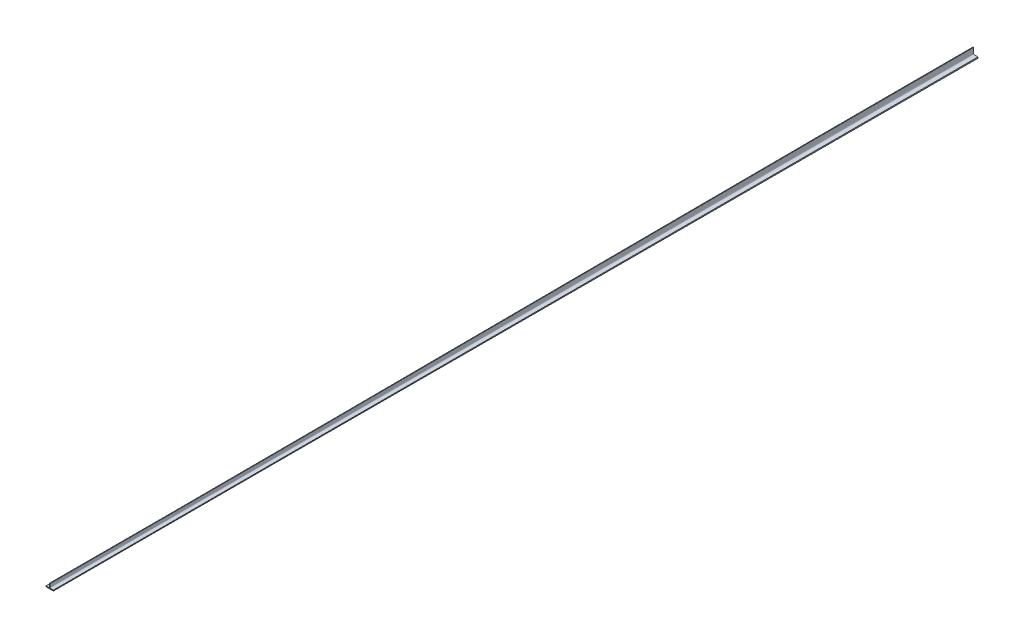
ISO-10303-21;
HEADER;
FILE_DESCRIPTION(('STEP AP214'),'2;1');
FILE_NAME('part.step','',(''),(''),'','','');
FILE_SCHEMA(('AUTOMOTIVE_DESIGN { 1 0 10303 214 1 1 1 1 }'));
ENDSEC;
DATA;
#1=APPLICATION_CONTEXT('core data for automotive mechanical design processes');
#2=APPLICATION_PROTOCOL_DEFINITION('international standard','automotive_design',2000,#1);
#3=PRODUCT_CONTEXT('',#1,'mechanical');
#4=PRODUCT('Part','Part','',(#3));
#5=PRODUCT_RELATED_PRODUCT_CATEGORY('part','',(#4));
#6=PRODUCT_DEFINITION_FORMATION('','',#4);
#7=PRODUCT_DEFINITION_CONTEXT('part definition',#1,'design');
#8=PRODUCT_DEFINITION('design','',#6,#7);
#9=PRODUCT_DEFINITION_SHAPE('','',#8);
#10=(LENGTH_UNIT() NAMED_UNIT(*) SI_UNIT(.MILLI.,.METRE.));
#11=(NAMED_UNIT(*) PLANE_ANGLE_UNIT() SI_UNIT($,.RADIAN.));
#12=(NAMED_UNIT(*) SI_UNIT($,.STERADIAN.) SOLID_ANGLE_UNIT());
#13=UNCERTAINTY_MEASURE_WITH_UNIT(LENGTH_MEASURE(1.E-05),#10,'distance_accuracy_value','');
#14=(GEOMETRIC_REPRESENTATION_CONTEXT(3) GLOBAL_UNCERTAINTY_ASSIGNED_CONTEXT((#13)) GLOBAL_UNIT_ASSIGNED_CONTEXT((#10,
#11,#12)) REPRESENTATION_CONTEXT('',''));
#15=CARTESIAN_POINT('',(0.,0.,0.));
#16=DIRECTION('',(0.,0.,1.));
#17=DIRECTION('',(1.,0.,0.));
#18=AXIS2_PLACEMENT_3D('',#15,#16,#17);
#19=CARTESIAN_POINT('',(4.00000000000001,7.,5000.));
#20=DIRECTION('',(0.,0.,-1.));
#21=DIRECTION('',(-1.,0.,0.));
#22=AXIS2_PLACEMENT_3D('',#19,#20,#21);
#23=PLANE('',#22);
#24=DIRECTION('',(0.,1.,0.));
#25=VECTOR('',#24,1.);
#26=CARTESIAN_POINT('',(20.,0.,5000.));
#27=LINE('',#26,#25);
#28=CARTESIAN_POINT('',(20.,0.,5000.));
#29=VERTEX_POINT('',#28);
#30=CARTESIAN_POINT('',(20.,4.49999999999999,5000.));
#31=VERTEX_POINT('',#30);
#32=EDGE_CURVE('E471',#29,#31,#27,.T.);
#33=ORIENTED_EDGE('',*,*,#32,.T.);
#34=DIRECTION('',(-1.,0.,0.));
#35=VECTOR('',#34,1.);
#36=CARTESIAN_POINT('',(20.,4.49999999999999,5000.));
#37=LINE('',#36,#35);
#38=CARTESIAN_POINT('',(4.00000000000019,4.49999999999999,5000.));
#39=VERTEX_POINT('',#38);
#40=EDGE_CURVE('E400',#31,#39,#37,.T.);
#41=ORIENTED_EDGE('',*,*,#40,.T.);
#42=CARTESIAN_POINT('',(4.00000000000001,7.,5000.));
#43=DIRECTION('',(0.,0.,-1.));
#44=DIRECTION('',(-1.,0.,0.));
#45=AXIS2_PLACEMENT_3D('',#42,#43,#44);
#46=CIRCLE('',#45,2.5);
#47=CARTESIAN_POINT('',(1.50000000000001,6.99999999999966,5000.));
#48=VERTEX_POINT('',#47);
#49=EDGE_CURVE('E411',#39,#48,#46,.T.);
#50=ORIENTED_EDGE('',*,*,#49,.T.);
#51=DIRECTION('',(0.,1.,0.));
#52=VECTOR('',#51,1.);
#53=CARTESIAN_POINT('',(1.5,7.00000000000002,5000.));
#54=LINE('',#53,#52);
#55=CARTESIAN_POINT('',(1.5,26.,5000.));
#56=VERTEX_POINT('',#55);
#57=EDGE_CURVE('E423',#48,#56,#54,.T.);
#58=ORIENTED_EDGE('',*,*,#57,.T.);
#59=DIRECTION('',(-1.,0.,0.));
#60=VECTOR('',#59,1.);
#61=CARTESIAN_POINT('',(1.5,26.,5000.));
#62=LINE('',#61,#60);
#63=CARTESIAN_POINT('',(-1.5,26.,5000.));
#64=VERTEX_POINT('',#63);
#65=EDGE_CURVE('E437',#56,#64,#62,.T.);
#66=ORIENTED_EDGE('',*,*,#65,.T.);
#67=DIRECTION('',(0.,-1.,0.));
#68=VECTOR('',#67,1.);
#69=CARTESIAN_POINT('',(-1.5,26.,5000.));
#70=LINE('',#69,#68);
#71=CARTESIAN_POINT('',(-1.5,7.00000000000001,5000.));
#72=VERTEX_POINT('',#71);
#73=EDGE_CURVE('E671',#64,#72,#70,.T.);
#74=ORIENTED_EDGE('',*,*,#73,.T.);
#75=CARTESIAN_POINT('',(-4.,6.99999999999999,5000.));
#76=DIRECTION('',(0.,0.,-1.));
#77=DIRECTION('',(-1.,0.,0.));
#78=AXIS2_PLACEMENT_3D('',#75,#76,#77);
#79=CIRCLE('',#78,2.5);
#80=CARTESIAN_POINT('',(-4.00000000006954,4.49999999999999,5000.));
#81=VERTEX_POINT('',#80);
#82=EDGE_CURVE('E523',#72,#81,#79,.T.);
#83=ORIENTED_EDGE('',*,*,#82,.T.);
#84=DIRECTION('',(-1.,0.,0.));
#85=VECTOR('',#84,1.);
#86=CARTESIAN_POINT('',(-4.00000000000002,4.49999999999999,5000.));
#87=LINE('',#86,#85);
#88=CARTESIAN_POINT('',(-20.,4.49999999999999,5000.));
#89=VERTEX_POINT('',#88);
#90=EDGE_CURVE('E686',#81,#89,#87,.T.);
#91=ORIENTED_EDGE('',*,*,#90,.T.);
#92=DIRECTION('',(0.,-1.,0.));
#93=VECTOR('',#92,1.);
#94=CARTESIAN_POINT('',(-20.,4.49999999999999,5000.));
#95=LINE('',#94,#93);
#96=CARTESIAN_POINT('',(-20.,0.,5000.));
#97=VERTEX_POINT('',#96);
#98=EDGE_CURVE('E231',#89,#97,#95,.T.);
#99=ORIENTED_EDGE('',*,*,#98,.T.);
#100=DIRECTION('',(1.,0.,0.));
#101=VECTOR('',#100,1.);
#102=CARTESIAN_POINT('',(-20.,0.,5000.));
#103=LINE('',#102,#101);
#104=EDGE_CURVE('E12',#97,#29,#103,.T.);
#105=ORIENTED_EDGE('',*,*,#104,.T.);
#106=EDGE_LOOP('',(#33,#41,#50,#58,#66,#74,#83,#91,#99,#105));
#107=FACE_BOUND('',#106,.T.);
#108=ADVANCED_FACE('F221',(#107),#23,.F.);
#109=CARTESIAN_POINT('',(-5.75,10.5,0.));
#110=DIRECTION('',(0.,0.,1.));
#111=DIRECTION('',(1.,0.,0.));
#112=AXIS2_PLACEMENT_3D('',#109,#110,#111);
#113=PLANE('',#112);
#114=DIRECTION('',(0.,-1.,0.));
#115=VECTOR('',#114,1.);
#116=CARTESIAN_POINT('',(-25.,0.,0.));
#117=LINE('',#116,#115);
#118=CARTESIAN_POINT('',(-25.,6.5,0.));
#119=VERTEX_POINT('',#118);
#120=CARTESIAN_POINT('',(-25.,0.,0.));
#121=VERTEX_POINT('',#120);
#122=EDGE_CURVE('E307',#119,#121,#117,.T.);
#123=ORIENTED_EDGE('',*,*,#122,.F.);
#124=DIRECTION('',(-1.,0.,0.));
#125=VECTOR('',#124,1.);
#126=CARTESIAN_POINT('',(-25.,6.5,0.));
#127=LINE('',#126,#125);
#128=CARTESIAN_POINT('',(-5.74999999999348,6.5,0.));
#129=VERTEX_POINT('',#128);
#130=EDGE_CURVE('E324',#129,#119,#127,.T.);
#131=ORIENTED_EDGE('',*,*,#130,.F.);
#132=CARTESIAN_POINT('',(-5.75,10.5,0.));
#133=DIRECTION('',(0.,0.,-1.));
#134=DIRECTION('',(1.,0.,0.));
#135=AXIS2_PLACEMENT_3D('',#132,#133,#134);
#136=CIRCLE('',#135,4.);
#137=CARTESIAN_POINT('',(-1.75,10.5,0.));
#138=VERTEX_POINT('',#137);
#139=EDGE_CURVE('E569',#138,#129,#136,.T.);
#140=ORIENTED_EDGE('',*,*,#139,.F.);
#141=DIRECTION('',(0.,-1.,0.));
#142=VECTOR('',#141,1.);
#143=CARTESIAN_POINT('',(-1.75,10.5,0.));
#144=LINE('',#143,#142);
#145=CARTESIAN_POINT('',(-1.75,40.,0.));
#146=VERTEX_POINT('',#145);
#147=EDGE_CURVE('E485',#146,#138,#144,.T.);
#148=ORIENTED_EDGE('',*,*,#147,.F.);
#149=DIRECTION('',(-1.,0.,0.));
#150=VECTOR('',#149,1.);
#151=CARTESIAN_POINT('',(-1.75,40.,0.));
#152=LINE('',#151,#150);
#153=CARTESIAN_POINT('',(1.75,40.,0.));
#154=VERTEX_POINT('',#153);
#155=EDGE_CURVE('E591',#154,#146,#152,.T.);
#156=ORIENTED_EDGE('',*,*,#155,.F.);
#157=DIRECTION('',(0.,1.,0.));
#158=VECTOR('',#157,1.);
#159=CARTESIAN_POINT('',(1.75,10.5,0.));
#160=LINE('',#159,#158);
#161=CARTESIAN_POINT('',(1.75,10.5000000000239,0.));
#162=VERTEX_POINT('',#161);
#163=EDGE_CURVE('E604',#162,#154,#160,.T.);
#164=ORIENTED_EDGE('',*,*,#163,.F.);
#165=CARTESIAN_POINT('',(5.75,10.5,0.));
#166=DIRECTION('',(0.,0.,-1.));
#167=DIRECTION('',(-1.,0.,0.));
#168=AXIS2_PLACEMENT_3D('',#165,#166,#167);
#169=CIRCLE('',#168,4.);
#170=CARTESIAN_POINT('',(5.74999999993137,6.5,0.));
#171=VERTEX_POINT('',#170);
#172=EDGE_CURVE('E611',#171,#162,#169,.T.);
#173=ORIENTED_EDGE('',*,*,#172,.F.);
#174=DIRECTION('',(-1.,0.,0.));
#175=VECTOR('',#174,1.);
#176=CARTESIAN_POINT('',(25.,6.5,0.));
#177=LINE('',#176,#175);
#178=CARTESIAN_POINT('',(25.,6.5,0.));
#179=VERTEX_POINT('',#178);
#180=EDGE_CURVE('E742',#179,#171,#177,.T.);
#181=ORIENTED_EDGE('',*,*,#180,.F.);
#182=DIRECTION('',(0.,1.,0.));
#183=VECTOR('',#182,1.);
#184=CARTESIAN_POINT('',(25.,0.,0.));
#185=LINE('',#184,#183);
#186=CARTESIAN_POINT('',(25.,0.,0.));
#187=VERTEX_POINT('',#186);
#188=EDGE_CURVE('E310',#187,#179,#185,.T.);
#189=ORIENTED_EDGE('',*,*,#188,.F.);
#190=DIRECTION('',(1.,0.,0.));
#191=VECTOR('',#190,1.);
#192=CARTESIAN_POINT('',(-25.,0.,0.));
#193=LINE('',#192,#191);
#194=EDGE_CURVE('E303',#121,#187,#193,.T.);
#195=ORIENTED_EDGE('',*,*,#194,.F.);
#196=EDGE_LOOP('',(#123,#131,#140,#148,#156,#164,#173,#181,#189,#195));
#197=FACE_BOUND('',#196,.T.);
#198=ADVANCED_FACE('F305',(#197),#113,.F.);
#199=CARTESIAN_POINT('',(-1.75,10.5,0.));
#200=CARTESIAN_POINT('',(-1.76041665865072,10.6458332211101,166.666794921776));
#201=CARTESIAN_POINT('',(-1.72796755953533,10.1915458334947,1500.00232594243));
#202=CARTESIAN_POINT('',(-1.50305376714055,7.04275273996762,3166.6637854278));
#203=CARTESIAN_POINT('',(-1.4814814927412,6.74074089837668,4666.66646399189));
#204=CARTESIAN_POINT('',(-1.5,7.00000000000001,5000.));
#205=CARTESIAN_POINT('',(-1.75,10.0300900609855,0.));
#206=CARTESIAN_POINT('',(-1.76057678876177,10.1698963593273,166.666784586186));
#207=CARTESIAN_POINT('',(-1.72738315193246,9.73703498879041,1500.00236346311));
#208=CARTESIAN_POINT('',(-1.50361901353656,6.66865880947282,3166.66375249179));
#209=CARTESIAN_POINT('',(-1.48119681712089,6.38472128154824,4666.66648032468));
#210=CARTESIAN_POINT('',(-1.5,6.63326584885906,5000.));
#211=CARTESIAN_POINT('',(-1.91725946446787,9.01920723896802,0.));
#212=CARTESIAN_POINT('',(-1.92815651345172,9.14695969177323,166.666763915007));
#213=CARTESIAN_POINT('',(-1.89425709920794,8.74777196889063,1500.00243850448));
#214=CARTESIAN_POINT('',(-1.65810540869848,6.01232462692904,3166.66368661978));
#215=CARTESIAN_POINT('',(-1.63563563736816,5.74517506881954,4666.66651299026));
#216=CARTESIAN_POINT('',(-1.65500817148788,5.97229056750532,5000.));
#217=CARTESIAN_POINT('',(-2.83482059203226,7.58482059203225,0.));
#218=CARTESIAN_POINT('',(-2.86149230183344,7.68434394742151,166.66672801735));
#219=CARTESIAN_POINT('',(-2.77861383438785,7.37462384711103,1500.00256882163));
#220=CARTESIAN_POINT('',(-2.19884393375781,5.21999096220804,3166.66357222618));
#221=CARTESIAN_POINT('',(-2.14404507482599,5.01453102899276,4666.66656971743));
#222=CARTESIAN_POINT('',(-2.19146145186028,5.19146145186028,5000.));
#223=CARTESIAN_POINT('',(-4.26920723896802,6.66725946446786,0.));
#224=CARTESIAN_POINT('',(-4.32381513687989,6.75110520060494,166.666725389624));
#225=CARTESIAN_POINT('',(-4.15283095310561,6.48991295106523,1500.00257836091));
#226=CARTESIAN_POINT('',(-2.99014363299043,4.6795949849866,3166.66356385254));
#227=CARTESIAN_POINT('',(-2.8752098531299,4.50594907389413,4666.66657386989));
#228=CARTESIAN_POINT('',(-2.97229056750534,4.65500817148786,5000.));
#229=CARTESIAN_POINT('',(-5.28009006098553,6.5,0.));
#230=CARTESIAN_POINT('',(-5.34746829753325,6.58346199158506,166.666735534587));
#231=CARTESIAN_POINT('',(-5.1394790749114,6.32327069477005,1500.00254153225));
#232=CARTESIAN_POINT('',(-3.64900696822546,4.52488449776451,3166.66359618106));
#233=CARTESIAN_POINT('',(-3.51348230683894,4.35162311317983,4666.66655783834));
#234=CARTESIAN_POINT('',(-3.63326584885907,4.49999999999999,5000.));
#235=CARTESIAN_POINT('',(-7.40785550019297,6.5,0.));
#236=CARTESIAN_POINT('',(-7.50031175854618,6.58287925684215,166.666756815213));
#237=CARTESIAN_POINT('',(-7.20559005126586,6.32539743133699,1500.00246427844));
#238=CARTESIAN_POINT('',(-5.33510641951328,4.52282749677106,3166.66366399518));
#239=CARTESIAN_POINT('',(-5.12948171528132,4.35265908228241,4666.66652420968));
#240=CARTESIAN_POINT('',(-5.29384841455515,4.49999999999999,5000.));
#241=CARTESIAN_POINT('',(-10.6391788230394,6.5,0.));
#242=CARTESIAN_POINT('',(-10.7496348322902,6.58354390944906,166.666780698332));
#243=CARTESIAN_POINT('',(-10.4087571915927,6.32297172816222,1500.00237757696));
#244=CARTESIAN_POINT('',(-7.96371400387778,4.52517367603479,3166.66374010251));
#245=CARTESIAN_POINT('',(-7.74172813198465,4.35147747296844,4666.66648646847));
#246=CARTESIAN_POINT('',(-7.93809439810482,4.50000000000001,5000.00000000001));
#247=CARTESIAN_POINT('',(-15.375,6.5,0.));
#248=CARTESIAN_POINT('',(-15.516377705298,6.58327708444848,166.66682676621));
#249=CARTESIAN_POINT('',(-15.0748145998053,6.32394552645723,1500.00221033945));
#250=CARTESIAN_POINT('',(-12.0438832453049,4.52423181966586,3166.66388690518));
#251=CARTESIAN_POINT('',(-11.7486618072331,4.35195182002062,4666.66641366979));
#252=CARTESIAN_POINT('',(-12.,4.49999999999998,4999.99999999999));
#253=CARTESIAN_POINT('',(-20.1108211769606,6.5,0.));
#254=CARTESIAN_POINT('',(-20.2786035349036,6.58334727180046,166.666874149964));
#255=CARTESIAN_POINT('',(-19.7573573180287,6.32368937124869,1500.002038325));
#256=CARTESIAN_POINT('',(-16.1081076855479,4.52447959086938,3166.66403790105));
#257=CARTESIAN_POINT('',(-15.7636257791287,4.3518270336426,4666.66633879176));
#258=CARTESIAN_POINT('',(-16.0619056018952,4.50000000000001,5000.00000000001));
#259=CARTESIAN_POINT('',(-23.3421444998071,6.5,0.));
#260=CARTESIAN_POINT('',(-23.536960589608,6.58333787879478,166.66693721629));
#261=CARTESIAN_POINT('',(-22.9275542207547,6.32372365062078,1500.00180937903));
#262=CARTESIAN_POINT('',(-18.7686045672862,4.52444645474237,3166.66423887202));
#263=CARTESIAN_POINT('',(-18.3598117512132,4.35184372055708,4666.66623913131));
#264=CARTESIAN_POINT('',(-18.7061515854449,4.49999999999999,5000.));
#265=CARTESIAN_POINT('',(-25.,6.5,0.));
#266=CARTESIAN_POINT('',(-25.2083329557299,6.58333318229194,166.666968749452));
#267=CARTESIAN_POINT('',(-24.559351975767,6.32374079030681,1500.00169490604));
#268=CARTESIAN_POINT('',(-20.0610747166972,4.52442988667886,3166.6643393575));
#269=CARTESIAN_POINT('',(-19.6296301600358,4.35185206401432,4666.6661893011));
#270=CARTESIAN_POINT('',(-20.,4.49999999999999,5000.));
#271=B_SPLINE_SURFACE_WITH_KNOTS('',3,3,((#199,#200,#201,#202,#203,#204),(#205,#206,#207,#208,
#209,#210),(#211,#212,#213,#214,#215,#216),(#217,#218,#219,#220,#221,#222),(#223,#224,#225,#226,
#227,#228),(#229,#230,#231,#232,#233,#234),(#235,#236,#237,#238,#239,#240),(#241,#242,#243,#244,
#245,#246),(#247,#248,#249,#250,#251,#252),(#253,#254,#255,#256,#257,#258),(#259,#260,#261,#262,
#263,#264),(#265,#266,#267,#268,#269,#270)),.UNSPECIFIED.,.F.,.F.,.F.,(4,1,1,1,2,1,1,1,4),(4,1,
1,4),(0.,0.0552116709786178,0.110423341957236,0.165635012935853,0.220846683914471,
0.415635012935853,0.610423341957235,0.805211670978618,1.),(0.,0.0999998594638137,
0.800000281072373,1.),.UNSPECIFIED.);
#272=CARTESIAN_POINT('',(-25.,6.5,0.));
#273=CARTESIAN_POINT('',(-25.2083329557299,6.58333318229194,166.666968749452));
#274=CARTESIAN_POINT('',(-24.559351975767,6.32374079030681,1500.00169490604));
#275=CARTESIAN_POINT('',(-20.0610747166972,4.52442988667886,3166.6643393575));
#276=CARTESIAN_POINT('',(-19.6296301600358,4.35185206401432,4666.6661893011));
#277=CARTESIAN_POINT('',(-20.,4.49999999999999,5000.));
#278=B_SPLINE_CURVE_WITH_KNOTS('',3,(#272,#273,#274,#275,#276,#277),.UNSPECIFIED.,.F.,.F.,(4,1,
1,4),(0.,0.0999998594638137,0.800000281072373,1.),.UNSPECIFIED.);
#279=EDGE_CURVE('E323',#119,#89,#278,.T.);
#280=CARTESIAN_POINT('',(-1.75,10.5,0.));
#281=CARTESIAN_POINT('',(-1.76041665865072,10.6458332211101,166.666794921776));
#282=CARTESIAN_POINT('',(-1.72796755953533,10.1915458334947,1500.00232594243));
#283=CARTESIAN_POINT('',(-1.50305376714055,7.04275273996762,3166.6637854278));
#284=CARTESIAN_POINT('',(-1.4814814927412,6.74074089837668,4666.66646399189));
#285=CARTESIAN_POINT('',(-1.5,7.00000000000001,5000.));
#286=B_SPLINE_CURVE_WITH_KNOTS('',3,(#280,#281,#282,#283,#284,#285),.UNSPECIFIED.,.F.,.F.,(4,1,
1,4),(0.,0.0999998594638137,0.800000281072373,1.),.UNSPECIFIED.);
#287=EDGE_CURVE('E315',#72,#138,#286,.F.);
#288=ORIENTED_EDGE('',*,*,#139,.T.);
#289=ORIENTED_EDGE('',*,*,#130,.T.);
#290=ORIENTED_EDGE('',*,*,#279,.T.);
#291=ORIENTED_EDGE('',*,*,#90,.F.);
#292=ORIENTED_EDGE('',*,*,#82,.F.);
#293=ORIENTED_EDGE('',*,*,#287,.T.);
#294=EDGE_LOOP('',(#288,#289,#290,#291,#292,#293));
#295=FACE_BOUND('',#294,.T.);
#296=ADVANCED_FACE('F528',(#295),#271,.T.);
#297=CARTESIAN_POINT('',(-25.,6.5,0.));
#298=CARTESIAN_POINT('',(-25.2083329557299,6.58333318229194,166.666968749452));
#299=CARTESIAN_POINT('',(-24.559351975767,6.32374079030681,1500.00169490604));
#300=CARTESIAN_POINT('',(-20.0610747166972,4.52442988667886,3166.6643393575));
#301=CARTESIAN_POINT('',(-19.6296301600358,4.35185206401432,4666.6661893011));
#302=CARTESIAN_POINT('',(-20.,4.49999999999999,5000.));
#303=CARTESIAN_POINT('',(-25.,4.33333333333333,0.));
#304=CARTESIAN_POINT('',(-25.2083329730909,4.38888878819463,166.66695486061));
#305=CARTESIAN_POINT('',(-24.5593519130407,4.21582719353787,1500.00174532589));
#306=CARTESIAN_POINT('',(-20.0610747667237,3.01628659111924,3166.66429509848));
#307=CARTESIAN_POINT('',(-19.6296301356494,2.90123470934288,4666.66621124891));
#308=CARTESIAN_POINT('',(-20.,3.,5000.));
#309=CARTESIAN_POINT('',(-25.,2.16666666666667,0.));
#310=CARTESIAN_POINT('',(-25.208332990452,2.19444439409731,166.666940971768));
#311=CARTESIAN_POINT('',(-24.5593518503143,2.10791359676894,1500.00179574573));
#312=CARTESIAN_POINT('',(-20.0610748167502,1.50814329555962,3166.66425083946));
#313=CARTESIAN_POINT('',(-19.6296301112629,1.45061735467144,4666.66623319673));
#314=CARTESIAN_POINT('',(-20.,1.5,5000.));
#315=CARTESIAN_POINT('',(-25.,0.,0.));
#316=CARTESIAN_POINT('',(-25.208333007813,0.,166.666927082926));
#317=CARTESIAN_POINT('',(-24.5593517875879,0.,1500.00184616558));
#318=CARTESIAN_POINT('',(-20.0610748667768,0.,3166.66420658043));
#319=CARTESIAN_POINT('',(-19.6296300868764,0.,4666.66625514454));
#320=CARTESIAN_POINT('',(-20.,0.,5000.));
#321=B_SPLINE_SURFACE_WITH_KNOTS('',3,3,((#297,#298,#299,#300,#301,#302),(#303,#304,#305,#306,
#307,#308),(#309,#310,#311,#312,#313,#314),(#315,#316,#317,#318,#319,#320)),.UNSPECIFIED.,.F.,
.F.,.F.,(4,4),(4,1,1,4),(0.,1.),(0.,0.0999998594638137,0.800000281072373,1.),.UNSPECIFIED.);
#322=CARTESIAN_POINT('',(-25.,0.,0.));
#323=CARTESIAN_POINT('',(-25.208333007813,0.,166.666927082926));
#324=CARTESIAN_POINT('',(-24.5593517875879,0.,1500.00184616558));
#325=CARTESIAN_POINT('',(-20.0610748667768,0.,3166.66420658043));
#326=CARTESIAN_POINT('',(-19.6296300868764,0.,4666.66625514454));
#327=CARTESIAN_POINT('',(-20.,0.,5000.));
#328=B_SPLINE_CURVE_WITH_KNOTS('',3,(#322,#323,#324,#325,#326,#327),.UNSPECIFIED.,.F.,.F.,(4,1,
1,4),(0.,0.0999998594638137,0.800000281072373,1.),.UNSPECIFIED.);
#329=EDGE_CURVE('E246',#121,#97,#328,.T.);
#330=ORIENTED_EDGE('',*,*,#122,.T.);
#331=ORIENTED_EDGE('',*,*,#329,.T.);
#332=ORIENTED_EDGE('',*,*,#98,.F.);
#333=ORIENTED_EDGE('',*,*,#279,.F.);
#334=EDGE_LOOP('',(#330,#331,#332,#333));
#335=FACE_BOUND('',#334,.T.);
#336=ADVANCED_FACE('F321',(#335),#321,.T.);
#337=CARTESIAN_POINT('',(-1.75,40.,0.));
#338=CARTESIAN_POINT('',(-1.76041653902338,40.5833261853089,166.668708959349));
#339=CARTESIAN_POINT('',(-1.72796799175511,38.7662075382858,1499.99537752378));
#340=CARTESIAN_POINT('',(-1.50305342242919,26.1709916560344,3166.66988482633));
#341=CARTESIAN_POINT('',(-1.48148166077788,24.9629730035608,4666.66343933166));
#342=CARTESIAN_POINT('',(-1.5,26.,5000.));
#343=CARTESIAN_POINT('',(-1.75,30.1666666666667,0.));
#344=CARTESIAN_POINT('',(-1.76041657889916,30.6041618639093,166.668070946825));
#345=CARTESIAN_POINT('',(-1.72796784768185,29.2413203033555,1499.99769366333));
#346=CARTESIAN_POINT('',(-1.50305353733298,19.7949120173455,3166.66785169348));
#347=CARTESIAN_POINT('',(-1.48148160476565,18.8888956351661,4666.66444755174));
#348=CARTESIAN_POINT('',(-1.5,19.6666666666667,5000.));
#349=CARTESIAN_POINT('',(-1.75,20.3333333333334,0.));
#350=CARTESIAN_POINT('',(-1.76041661877494,20.6249975425098,166.6674329343));
#351=CARTESIAN_POINT('',(-1.72796770360859,19.7164330684251,1500.00000980288));
#352=CARTESIAN_POINT('',(-1.50305365223676,13.4188323786566,3166.66581856064));
#353=CARTESIAN_POINT('',(-1.48148154875342,12.8148182667714,4666.66545577181));
#354=CARTESIAN_POINT('',(-1.5,13.3333333333333,5000.));
#355=CARTESIAN_POINT('',(-1.75,10.5,0.));
#356=CARTESIAN_POINT('',(-1.76041665865072,10.6458332211101,166.666794921776));
#357=CARTESIAN_POINT('',(-1.72796755953533,10.1915458334947,1500.00232594243));
#358=CARTESIAN_POINT('',(-1.50305376714055,7.04275273996762,3166.6637854278));
#359=CARTESIAN_POINT('',(-1.4814814927412,6.74074089837668,4666.66646399189));
#360=CARTESIAN_POINT('',(-1.5,7.00000000000001,5000.));
#361=B_SPLINE_SURFACE_WITH_KNOTS('',3,3,((#337,#338,#339,#340,#341,#342),(#343,#344,#345,#346,
#347,#348),(#349,#350,#351,#352,#353,#354),(#355,#356,#357,#358,#359,#360)),.UNSPECIFIED.,.F.,
.F.,.F.,(4,4),(4,1,1,4),(0.,1.),(0.,0.0999998594638137,0.800000281072373,1.),.UNSPECIFIED.);
#362=CARTESIAN_POINT('',(-1.75,40.,0.));
#363=CARTESIAN_POINT('',(-1.76041653902338,40.5833261853089,166.668708959349));
#364=CARTESIAN_POINT('',(-1.72796799175511,38.7662075382858,1499.99537752378));
#365=CARTESIAN_POINT('',(-1.50305342242919,26.1709916560344,3166.66988482633));
#366=CARTESIAN_POINT('',(-1.48148166077788,24.9629730035608,4666.66343933166));
#367=CARTESIAN_POINT('',(-1.5,26.,5000.));
#368=B_SPLINE_CURVE_WITH_KNOTS('',3,(#362,#363,#364,#365,#366,#367),.UNSPECIFIED.,.F.,.F.,(4,1,
1,4),(0.,0.0999998594638137,0.800000281072373,1.),.UNSPECIFIED.);
#369=EDGE_CURVE('E464',#146,#64,#368,.T.);
#370=ORIENTED_EDGE('',*,*,#147,.T.);
#371=ORIENTED_EDGE('',*,*,#287,.F.);
#372=ORIENTED_EDGE('',*,*,#73,.F.);
#373=ORIENTED_EDGE('',*,*,#369,.F.);
#374=EDGE_LOOP('',(#370,#371,#372,#373));
#375=FACE_BOUND('',#374,.T.);
#376=ADVANCED_FACE('F491',(#375),#361,.T.);
#377=CARTESIAN_POINT('',(-25.,0.,0.));
#378=DIRECTION('',(0.,-1.,0.));
#379=DIRECTION('',(1.,0.,0.));
#380=AXIS2_PLACEMENT_3D('',#377,#378,#379);
#381=PLANE('',#380);
#382=ORIENTED_EDGE('',*,*,#194,.T.);
#383=CARTESIAN_POINT('',(25.,0.,0.));
#384=CARTESIAN_POINT('',(25.208333007813,0.,166.666927082926));
#385=CARTESIAN_POINT('',(24.5593517875879,0.,1500.00184616558));
#386=CARTESIAN_POINT('',(20.0610748667768,0.,3166.66420658043));
#387=CARTESIAN_POINT('',(19.6296300868764,0.,4666.66625514454));
#388=CARTESIAN_POINT('',(20.,0.,5000.));
#389=B_SPLINE_CURVE_WITH_KNOTS('',3,(#383,#384,#385,#386,#387,#388),.UNSPECIFIED.,.F.,.F.,(4,1,
1,4),(0.,0.0999998594638137,0.800000281072373,1.),.UNSPECIFIED.);
#390=EDGE_CURVE('E330',#187,#29,#389,.T.);
#391=ORIENTED_EDGE('',*,*,#390,.T.);
#392=ORIENTED_EDGE('',*,*,#104,.F.);
#393=ORIENTED_EDGE('',*,*,#329,.F.);
#394=EDGE_LOOP('',(#382,#391,#392,#393));
#395=FACE_BOUND('',#394,.T.);
#396=ADVANCED_FACE('F328',(#395),#381,.T.);
#397=CARTESIAN_POINT('',(25.,0.,0.));
#398=CARTESIAN_POINT('',(25.208333007813,0.,166.666927082926));
#399=CARTESIAN_POINT('',(24.5593517875879,0.,1500.00184616558));
#400=CARTESIAN_POINT('',(20.0610748667768,0.,3166.66420658043));
#401=CARTESIAN_POINT('',(19.6296300868764,0.,4666.66625514454));
#402=CARTESIAN_POINT('',(20.,0.,5000.));
#403=CARTESIAN_POINT('',(25.,2.16666666666667,0.));
#404=CARTESIAN_POINT('',(25.208332990452,2.19444439409731,166.666940971768));
#405=CARTESIAN_POINT('',(24.5593518503143,2.10791359676894,1500.00179574573));
#406=CARTESIAN_POINT('',(20.0610748167502,1.50814329555962,3166.66425083946));
#407=CARTESIAN_POINT('',(19.6296301112629,1.45061735467144,4666.66623319673));
#408=CARTESIAN_POINT('',(20.,1.5,5000.));
#409=CARTESIAN_POINT('',(25.,4.33333333333333,0.));
#410=CARTESIAN_POINT('',(25.2083329730909,4.38888878819463,166.66695486061));
#411=CARTESIAN_POINT('',(24.5593519130407,4.21582719353787,1500.00174532589));
#412=CARTESIAN_POINT('',(20.0610747667237,3.01628659111924,3166.66429509848));
#413=CARTESIAN_POINT('',(19.6296301356494,2.90123470934288,4666.66621124891));
#414=CARTESIAN_POINT('',(20.,3.,5000.));
#415=CARTESIAN_POINT('',(25.,6.5,0.));
#416=CARTESIAN_POINT('',(25.2083329557299,6.58333318229194,166.666968749452));
#417=CARTESIAN_POINT('',(24.559351975767,6.32374079030681,1500.00169490604));
#418=CARTESIAN_POINT('',(20.0610747166972,4.52442988667886,3166.6643393575));
#419=CARTESIAN_POINT('',(19.6296301600358,4.35185206401432,4666.6661893011));
#420=CARTESIAN_POINT('',(20.,4.49999999999999,5000.));
#421=B_SPLINE_SURFACE_WITH_KNOTS('',3,3,((#397,#398,#399,#400,#401,#402),(#403,#404,#405,#406,
#407,#408),(#409,#410,#411,#412,#413,#414),(#415,#416,#417,#418,#419,#420)),.UNSPECIFIED.,.F.,
.F.,.F.,(4,4),(4,1,1,4),(0.,1.),(0.,0.0999998594638137,0.800000281072373,1.),.UNSPECIFIED.);
#422=CARTESIAN_POINT('',(25.,6.5,0.));
#423=CARTESIAN_POINT('',(25.2083329557299,6.58333318229194,166.666968749452));
#424=CARTESIAN_POINT('',(24.559351975767,6.32374079030681,1500.00169490604));
#425=CARTESIAN_POINT('',(20.0610747166972,4.52442988667886,3166.6643393575));
#426=CARTESIAN_POINT('',(19.6296301600358,4.35185206401432,4666.6661893011));
#427=CARTESIAN_POINT('',(20.,4.49999999999999,5000.));
#428=B_SPLINE_CURVE_WITH_KNOTS('',3,(#422,#423,#424,#425,#426,#427),.UNSPECIFIED.,.F.,.F.,(4,1,
1,4),(0.,0.0999998594638137,0.800000281072373,1.),.UNSPECIFIED.);
#429=EDGE_CURVE('E332',#179,#31,#428,.T.);
#430=ORIENTED_EDGE('',*,*,#188,.T.);
#431=ORIENTED_EDGE('',*,*,#429,.T.);
#432=ORIENTED_EDGE('',*,*,#32,.F.);
#433=ORIENTED_EDGE('',*,*,#390,.F.);
#434=EDGE_LOOP('',(#430,#431,#432,#433));
#435=FACE_BOUND('',#434,.T.);
#436=ADVANCED_FACE('F363',(#435),#421,.T.);
#437=CARTESIAN_POINT('',(25.,6.5,0.));
#438=CARTESIAN_POINT('',(25.2083329557299,6.58333318229194,166.666968749452));
#439=CARTESIAN_POINT('',(24.559351975767,6.32374079030681,1500.00169490604));
#440=CARTESIAN_POINT('',(20.0610747166972,4.52442988667886,3166.6643393575));
#441=CARTESIAN_POINT('',(19.6296301600358,4.35185206401432,4666.6661893011));
#442=CARTESIAN_POINT('',(20.,4.49999999999999,5000.));
#443=CARTESIAN_POINT('',(23.2708675053462,6.5,0.));
#444=CARTESIAN_POINT('',(23.4620894768583,6.58333662098395,166.6669297409));
#445=CARTESIAN_POINT('',(22.8614855665221,6.32372824123831,1500.0018365165));
#446=CARTESIAN_POINT('',(18.8250199368705,4.52444201234531,3166.6642150505));
#447=CARTESIAN_POINT('',(18.4186212563438,4.3518459580603,4666.66625094428));
#448=CARTESIAN_POINT('',(18.7585715422998,4.49999999999999,5000.));
#449=CARTESIAN_POINT('',(19.9840068946728,6.5,0.));
#450=CARTESIAN_POINT('',(20.1410068977494,6.58334349836799,166.666851723794));
#451=CARTESIAN_POINT('',(19.6543769592137,6.3237031431013,1500.0021197374));
#452=CARTESIAN_POINT('',(16.2186622365732,4.52446626367819,3166.66396643649));
#453=CARTESIAN_POINT('',(15.898678389759,4.35183374615226,4666.66637423065));
#454=CARTESIAN_POINT('',(16.1777895676989,4.49999999999998,5000.));
#455=CARTESIAN_POINT('',(15.2747161456717,6.5,0.));
#456=CARTESIAN_POINT('',(15.407828543513,6.58329222932354,166.666814180508));
#457=CARTESIAN_POINT('',(14.9920051189238,6.3238902542567,1500.00225602859));
#458=CARTESIAN_POINT('',(12.139680700083,4.52428527580739,3166.66384679882));
#459=CARTESIAN_POINT('',(11.8615599633816,4.35192489814013,4666.66643355833));
#460=CARTESIAN_POINT('',(12.098204270261,4.50000000000001,5000.));
#461=CARTESIAN_POINT('',(10.6058879123595,6.5,0.));
#462=CARTESIAN_POINT('',(10.7144534651925,6.58348714092362,166.666778382693));
#463=CARTESIAN_POINT('',(10.3784675588044,6.32317890946948,1500.00238598329));
#464=CARTESIAN_POINT('',(7.9929412047903,4.52497328683936,3166.66373272337));
#465=CARTESIAN_POINT('',(7.77276676775505,4.35157839524645,4666.66649012774));
#466=CARTESIAN_POINT('',(7.96577222150617,4.49999999999999,5000.));
#467=CARTESIAN_POINT('',(7.40785550019297,6.5,0.));
#468=CARTESIAN_POINT('',(7.49879197138772,6.58300162768058,166.666755550625));
#469=CARTESIAN_POINT('',(7.21113663579228,6.3249508292173,1500.0024688692));
#470=CARTESIAN_POINT('',(5.32974169035896,4.52325945582812,3166.66365996535));
#471=CARTESIAN_POINT('',(5.1321835595168,4.35244153431149,4666.66652620805));
#472=CARTESIAN_POINT('',(5.29384841455515,4.5,5000.));
#473=CARTESIAN_POINT('',(5.28009006098553,6.49999999999999,0.));
#474=CARTESIAN_POINT('',(5.34789907277,6.58342730624995,166.666735893027));
#475=CARTESIAN_POINT('',(5.13790692630545,6.32339728166267,1500.00254023102));
#476=CARTESIAN_POINT('',(3.65052757093532,4.52476206136672,3166.6635973233));
#477=CARTESIAN_POINT('',(3.51271648408295,4.35168477594502,4666.66655727191));
#478=CARTESIAN_POINT('',(3.63326584885908,4.49999999999999,5000.));
#479=CARTESIAN_POINT('',(4.29142144120617,6.66774194243641,0.));
#480=CARTESIAN_POINT('',(4.34753608668045,6.75144956764452,166.666726583699));
#481=CARTESIAN_POINT('',(4.17219745923478,6.4907217057311,1500.00257402613));
#482=CARTESIAN_POINT('',(2.97061589611494,4.68274536765786,3166.66356765763));
#483=CARTESIAN_POINT('',(2.85327733738916,4.50945752344384,4666.66657198295));
#484=CARTESIAN_POINT('',(2.95303671445526,4.65827109066395,5000.));
#485=CARTESIAN_POINT('',(2.90938939555387,7.52507281015334,0.));
#486=CARTESIAN_POINT('',(2.94081333258454,7.62084914856323,166.666725800443));
#487=CARTESIAN_POINT('',(2.84293526117406,7.3226020636139,1500.00257686953));
#488=CARTESIAN_POINT('',(2.16422898256122,5.25261211939048,3166.66356516168));
#489=CARTESIAN_POINT('',(2.09917539567273,5.054491471997,4666.66657322069));
#490=CARTESIAN_POINT('',(2.15504017703143,5.22476053057063,5000.));
#491=CARTESIAN_POINT('',(1.9560167491393,8.90934163087635,0.));
#492=CARTESIAN_POINT('',(1.96923090834362,9.02967804004993,166.666752993654));
#493=CARTESIAN_POINT('',(1.92855762073628,8.65435550011235,1500.00247815162));
#494=CARTESIAN_POINT('',(1.6340468453768,6.06472066320116,3166.66365181715));
#495=CARTESIAN_POINT('',(1.60771544967333,5.8145394779001,4666.6665302487));
#496=CARTESIAN_POINT('',(1.63120729111704,6.02847089450231,5000.));
#497=CARTESIAN_POINT('',(1.75,9.98238222093739,0.));
#498=CARTESIAN_POINT('',(1.76116714596024,10.1198129239599,166.666780340892));
#499=CARTESIAN_POINT('',(1.72522859623448,9.69270355466302,1500.00237887456));
#500=CARTESIAN_POINT('',(1.50570292778672,6.70652541438713,3166.66373896348));
#501=CARTESIAN_POINT('',(1.48014729319313,6.42403082086362,4666.6664870333));
#502=CARTESIAN_POINT('',(1.50000000000001,6.66835210545393,5000.));
#503=CARTESIAN_POINT('',(1.75,12.9643143265011,0.));
#504=CARTESIAN_POINT('',(1.75684368126958,13.1501508985956,166.666864339567));
#505=CARTESIAN_POINT('',(1.74100742549662,12.5664723220203,1500.00207393911));
#506=CARTESIAN_POINT('',(1.49044144052591,8.64348951692435,3166.66400663865));
#507=CARTESIAN_POINT('',(1.48783345199051,8.2485584675389,4666.66635429461));
#508=CARTESIAN_POINT('',(1.5,8.57893467137832,5000.));
#509=CARTESIAN_POINT('',(1.75,17.9540099311035,0.));
#510=CARTESIAN_POINT('',(1.76207420787793,18.2132969084908,166.667044303229));
#511=CARTESIAN_POINT('',(1.7219182007686,17.4076659183191,1500.00142062761));
#512=CARTESIAN_POINT('',(1.5089047957854,11.7702462002586,3166.66458012163));
#513=CARTESIAN_POINT('',(1.47853473224327,11.2376614369211,4666.66606990745));
#514=CARTESIAN_POINT('',(1.50000000000001,11.6986162506757,4999.99999999999));
#515=CARTESIAN_POINT('',(1.75,25.4779744578743,0.));
#516=CARTESIAN_POINT('',(1.75997459691338,25.8581888897192,166.667506181506));
#517=CARTESIAN_POINT('',(1.72958089750388,24.6736719987925,1499.99974389802));
#518=CARTESIAN_POINT('',(1.5014933527634,16.4661467886256,3166.66605197172));
#519=CARTESIAN_POINT('',(1.48226736382155,15.6785229263227,4666.66534002472));
#520=CARTESIAN_POINT('',(1.50000000000001,16.3544603615209,5000.00000000002));
#521=CARTESIAN_POINT('',(1.75,32.8887206048534,0.));
#522=CARTESIAN_POINT('',(1.7605270811598,33.3821210073845,166.66810391107));
#523=CARTESIAN_POINT('',(1.72756456078695,31.8434780167243,1499.99757399534));
#524=CARTESIAN_POINT('',(1.50344360296691,21.2209209985413,3166.66795673627));
#525=CARTESIAN_POINT('',(1.4812851555001,20.1956480300241,4666.66439546183));
#526=CARTESIAN_POINT('',(1.50000000000001,21.0728058321705,4999.99999999999));
#527=CARTESIAN_POINT('',(1.75,37.6666324946538,0.));
#528=CARTESIAN_POINT('',(1.76045338640218,38.2199834190368,166.668507276589));
#529=CARTESIAN_POINT('',(1.72783351476573,36.5001590567378,1499.99610968097));
#530=CARTESIAN_POINT('',(1.50318348260843,24.4787010152894,3166.66924212962));
#531=CARTESIAN_POINT('',(1.48141615901862,23.3410245260252,4666.66375804172));
#532=CARTESIAN_POINT('',(1.50000000000001,24.3247617910335,5000.));
#533=CARTESIAN_POINT('',(1.75,40.,0.));
#534=CARTESIAN_POINT('',(1.76041653902338,40.5833261853089,166.668708959349));
#535=CARTESIAN_POINT('',(1.72796799175511,38.7662075382858,1499.99537752378));
#536=CARTESIAN_POINT('',(1.50305342242919,26.1709916560344,3166.66988482633));
#537=CARTESIAN_POINT('',(1.48148166077788,24.9629730035608,4666.66343933166));
#538=CARTESIAN_POINT('',(1.5,26.,5000.));
#539=B_SPLINE_SURFACE_WITH_KNOTS('',3,3,((#437,#438,#439,#440,#441,#442),(#443,#444,#445,#446,
#447,#448),(#449,#450,#451,#452,#453,#454),(#455,#456,#457,#458,#459,#460),(#461,#462,#463,#464,
#465,#466),(#467,#468,#469,#470,#471,#472),(#473,#474,#475,#476,#477,#478),(#479,#480,#481,#482,
#483,#484),(#485,#486,#487,#488,#489,#490),(#491,#492,#493,#494,#495,#496),(#497,#498,#499,#500,
#501,#502),(#503,#504,#505,#506,#507,#508),(#509,#510,#511,#512,#513,#514),(#515,#516,#517,#518,
#519,#520),(#521,#522,#523,#524,#525,#526),(#527,#528,#529,#530,#531,#532),(#533,#534,#535,#536,
#537,#538)),.UNSPECIFIED.,.F.,.F.,.F.,(4,1,1,1,2,1,1,1,2,1,1,1,4),(4,1,1,4),(0.,
0.0949527496964072,0.189905499392814,0.284858249089222,0.379810998785629,0.406724828793266,
0.433638658800902,0.460552488808539,0.487466318816175,0.615599739112132,0.743733159408088,
0.871866579704044,1.),(0.,0.0999998594638137,0.800000281072373,1.),.UNSPECIFIED.);
#540=CARTESIAN_POINT('',(1.75,40.,0.));
#541=CARTESIAN_POINT('',(1.76041653902338,40.5833261853089,166.668708959349));
#542=CARTESIAN_POINT('',(1.72796799175511,38.7662075382858,1499.99537752378));
#543=CARTESIAN_POINT('',(1.50305342242919,26.1709916560344,3166.66988482633));
#544=CARTESIAN_POINT('',(1.48148166077788,24.9629730035608,4666.66343933166));
#545=CARTESIAN_POINT('',(1.5,26.,5000.));
#546=B_SPLINE_CURVE_WITH_KNOTS('',3,(#540,#541,#542,#543,#544,#545),.UNSPECIFIED.,.F.,.F.,(4,1,
1,4),(0.,0.0999998594638137,0.800000281072373,1.),.UNSPECIFIED.);
#547=EDGE_CURVE('E472',#154,#56,#546,.T.);
#548=ORIENTED_EDGE('',*,*,#180,.T.);
#549=ORIENTED_EDGE('',*,*,#172,.T.);
#550=ORIENTED_EDGE('',*,*,#163,.T.);
#551=ORIENTED_EDGE('',*,*,#547,.T.);
#552=ORIENTED_EDGE('',*,*,#57,.F.);
#553=ORIENTED_EDGE('',*,*,#49,.F.);
#554=ORIENTED_EDGE('',*,*,#40,.F.);
#555=ORIENTED_EDGE('',*,*,#429,.F.);
#556=EDGE_LOOP('',(#548,#549,#550,#551,#552,#553,#554,#555));
#557=FACE_BOUND('',#556,.T.);
#558=ADVANCED_FACE('F374',(#557),#539,.T.);
#559=CARTESIAN_POINT('',(1.75,40.,0.));
#560=CARTESIAN_POINT('',(1.76041653902337,40.5833261853089,166.668708959349));
#561=CARTESIAN_POINT('',(1.72796799175511,38.7662075382858,1499.99537752378));
#562=CARTESIAN_POINT('',(1.50305342242919,26.1709916560344,3166.66988482633));
#563=CARTESIAN_POINT('',(1.48148166077788,24.9629730035608,4666.66343933166));
#564=CARTESIAN_POINT('',(1.5,26.,5000.));
#565=CARTESIAN_POINT('',(0.583333333333333,40.,0.));
#566=CARTESIAN_POINT('',(0.586805513007791,40.5833261853089,166.668708959349));
#567=CARTESIAN_POINT('',(0.575989330585035,38.7662075382858,1499.99537752378));
#568=CARTESIAN_POINT('',(0.501017807476397,26.1709916560344,3166.66988482633));
#569=CARTESIAN_POINT('',(0.493827220259292,24.9629730035608,4666.66343933166));
#570=CARTESIAN_POINT('',(0.500000000000002,26.,5000.));
#571=CARTESIAN_POINT('',(-0.583333333333334,40.,0.));
#572=CARTESIAN_POINT('',(-0.586805513007792,40.5833261853089,166.668708959349));
#573=CARTESIAN_POINT('',(-0.575989330585036,38.7662075382858,1499.99537752378));
#574=CARTESIAN_POINT('',(-0.501017807476397,26.1709916560344,3166.66988482633));
#575=CARTESIAN_POINT('',(-0.493827220259292,24.9629730035608,4666.66343933166));
#576=CARTESIAN_POINT('',(-0.500000000000002,26.,5000.));
#577=CARTESIAN_POINT('',(-1.75,40.,0.));
#578=CARTESIAN_POINT('',(-1.76041653902338,40.5833261853089,166.668708959349));
#579=CARTESIAN_POINT('',(-1.72796799175511,38.7662075382858,1499.99537752378));
#580=CARTESIAN_POINT('',(-1.50305342242919,26.1709916560344,3166.66988482633));
#581=CARTESIAN_POINT('',(-1.48148166077788,24.9629730035608,4666.66343933166));
#582=CARTESIAN_POINT('',(-1.5,26.,5000.));
#583=B_SPLINE_SURFACE_WITH_KNOTS('',3,3,((#559,#560,#561,#562,#563,#564),(#565,#566,#567,#568,
#569,#570),(#571,#572,#573,#574,#575,#576),(#577,#578,#579,#580,#581,#582)),.UNSPECIFIED.,.F.,
.F.,.F.,(4,4),(4,1,1,4),(0.,1.),(0.,0.0999998594638137,0.800000281072373,1.),.UNSPECIFIED.);
#584=ORIENTED_EDGE('',*,*,#155,.T.);
#585=ORIENTED_EDGE('',*,*,#369,.T.);
#586=ORIENTED_EDGE('',*,*,#65,.F.);
#587=ORIENTED_EDGE('',*,*,#547,.F.);
#588=EDGE_LOOP('',(#584,#585,#586,#587));
#589=FACE_BOUND('',#588,.T.);
#590=ADVANCED_FACE('F442',(#589),#583,.T.);
#591=CLOSED_SHELL('',(#108,#198,#296,#336,#376,#396,#436,#558,#590));
#592=MANIFOLD_SOLID_BREP('B2',#591);
#593=ADVANCED_BREP_SHAPE_REPRESENTATION('',(#18,#592),#14);
#594=SHAPE_DEFINITION_REPRESENTATION(#9,#593);
ENDSEC;
END-ISO-10303-21;
